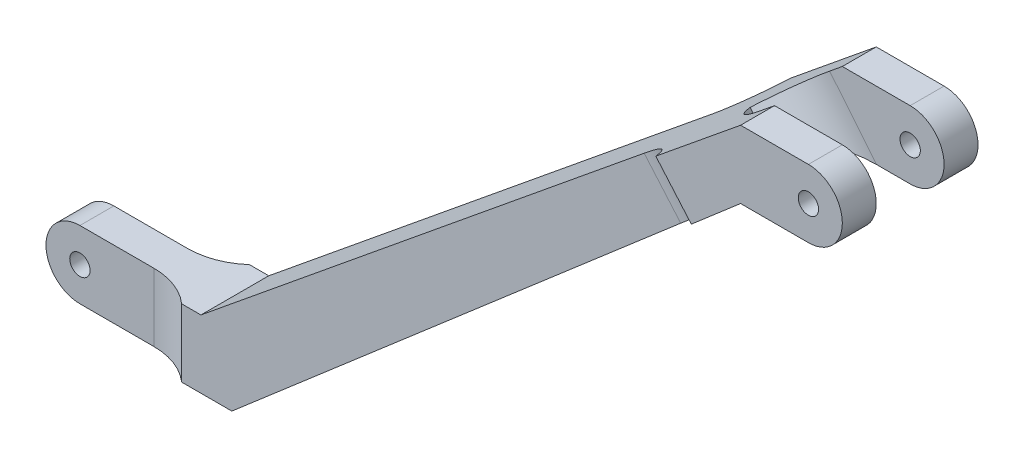
ISO-10303-21;
HEADER;
FILE_DESCRIPTION(('STEP AP214'),'2;1');
FILE_NAME('part.step','',(''),(''),'','','');
FILE_SCHEMA(('AUTOMOTIVE_DESIGN { 1 0 10303 214 1 1 1 1 }'));
ENDSEC;
DATA;
#1=APPLICATION_CONTEXT('core data for automotive mechanical design processes');
#2=APPLICATION_PROTOCOL_DEFINITION('international standard','automotive_design',2000,#1);
#3=PRODUCT_CONTEXT('',#1,'mechanical');
#4=PRODUCT('Part','Part','',(#3));
#5=PRODUCT_RELATED_PRODUCT_CATEGORY('part','',(#4));
#6=PRODUCT_DEFINITION_FORMATION('','',#4);
#7=PRODUCT_DEFINITION_CONTEXT('part definition',#1,'design');
#8=PRODUCT_DEFINITION('design','',#6,#7);
#9=PRODUCT_DEFINITION_SHAPE('','',#8);
#10=(LENGTH_UNIT() NAMED_UNIT(*) SI_UNIT(.MILLI.,.METRE.));
#11=(NAMED_UNIT(*) PLANE_ANGLE_UNIT() SI_UNIT($,.RADIAN.));
#12=(NAMED_UNIT(*) SI_UNIT($,.STERADIAN.) SOLID_ANGLE_UNIT());
#13=UNCERTAINTY_MEASURE_WITH_UNIT(LENGTH_MEASURE(1.E-05),#10,'distance_accuracy_value','');
#14=(GEOMETRIC_REPRESENTATION_CONTEXT(3) GLOBAL_UNCERTAINTY_ASSIGNED_CONTEXT((#13)) GLOBAL_UNIT_ASSIGNED_CONTEXT((#10,
#11,#12)) REPRESENTATION_CONTEXT('',''));
#15=CARTESIAN_POINT('',(0.,0.,0.));
#16=DIRECTION('',(0.,0.,1.));
#17=DIRECTION('',(1.,0.,0.));
#18=AXIS2_PLACEMENT_3D('',#15,#16,#17);
#19=CARTESIAN_POINT('',(0.,-5.,10.));
#20=DIRECTION('',(0.,1.,0.));
#21=DIRECTION('',(-1.,0.,0.));
#22=AXIS2_PLACEMENT_3D('',#19,#20,#21);
#23=PLANE('',#22);
#24=DIRECTION('',(0.,0.,-1.));
#25=VECTOR('',#24,1.);
#26=CARTESIAN_POINT('',(-10.,-5.,10.));
#27=LINE('',#26,#25);
#28=CARTESIAN_POINT('',(-10.,-5.,15.));
#29=VERTEX_POINT('',#28);
#30=CARTESIAN_POINT('',(-10.,-5.,9.20435754022233));
#31=VERTEX_POINT('',#30);
#32=EDGE_CURVE('E49',#29,#31,#27,.T.);
#33=ORIENTED_EDGE('',*,*,#32,.T.);
#34=CARTESIAN_POINT('',(-4.95474912406924,-5.,0.));
#35=DIRECTION('',(0.,1.,0.));
#36=DIRECTION('',(1.,0.,0.));
#37=AXIS2_PLACEMENT_3D('',#34,#35,#36);
#38=ELLIPSE('',#37,12.9069580740723,10.);
#39=CARTESIAN_POINT('',(-4.95474912406924,-5.,10.));
#40=VERTEX_POINT('',#39);
#41=EDGE_CURVE('E286',#31,#40,#38,.T.);
#42=ORIENTED_EDGE('',*,*,#41,.T.);
#43=DIRECTION('',(1.,0.,0.));
#44=VECTOR('',#43,1.);
#45=CARTESIAN_POINT('',(0.,-5.,10.));
#46=LINE('',#45,#44);
#47=CARTESIAN_POINT('',(0.,-5.,10.));
#48=VERTEX_POINT('',#47);
#49=EDGE_CURVE('E344',#40,#48,#46,.T.);
#50=ORIENTED_EDGE('',*,*,#49,.T.);
#51=DIRECTION('',(0.,0.,-1.));
#52=VECTOR('',#51,1.);
#53=CARTESIAN_POINT('',(0.,-5.,10.));
#54=LINE('',#53,#52);
#55=CARTESIAN_POINT('',(0.,-5.,15.));
#56=VERTEX_POINT('',#55);
#57=EDGE_CURVE('E231',#56,#48,#54,.T.);
#58=ORIENTED_EDGE('',*,*,#57,.F.);
#59=DIRECTION('',(1.,0.,0.));
#60=VECTOR('',#59,1.);
#61=CARTESIAN_POINT('',(0.,-5.,15.));
#62=LINE('',#61,#60);
#63=EDGE_CURVE('E359',#29,#56,#62,.T.);
#64=ORIENTED_EDGE('',*,*,#63,.F.);
#65=EDGE_LOOP('',(#33,#42,#50,#58,#64));
#66=FACE_BOUND('',#65,.T.);
#67=ADVANCED_FACE('F33',(#66),#23,.F.);
#68=CARTESIAN_POINT('',(0.,5.,10.));
#69=DIRECTION('',(0.,-1.,0.));
#70=DIRECTION('',(1.,0.,0.));
#71=AXIS2_PLACEMENT_3D('',#68,#69,#70);
#72=PLANE('',#71);
#73=DIRECTION('',(1.,0.,0.));
#74=VECTOR('',#73,1.);
#75=CARTESIAN_POINT('',(-7.50000000000001,5.,10.));
#76=LINE('',#75,#74);
#77=CARTESIAN_POINT('',(-10.,5.,10.));
#78=VERTEX_POINT('',#77);
#79=CARTESIAN_POINT('',(0.,5.,10.));
#80=VERTEX_POINT('',#79);
#81=EDGE_CURVE('E199',#78,#80,#76,.T.);
#82=ORIENTED_EDGE('',*,*,#81,.F.);
#83=DIRECTION('',(0.,0.,-1.));
#84=VECTOR('',#83,1.);
#85=CARTESIAN_POINT('',(-10.,5.,10.));
#86=LINE('',#85,#84);
#87=CARTESIAN_POINT('',(-10.,5.,15.));
#88=VERTEX_POINT('',#87);
#89=EDGE_CURVE('E216',#88,#78,#86,.T.);
#90=ORIENTED_EDGE('',*,*,#89,.F.);
#91=DIRECTION('',(-1.,0.,0.));
#92=VECTOR('',#91,1.);
#93=CARTESIAN_POINT('',(0.,5.,15.));
#94=LINE('',#93,#92);
#95=CARTESIAN_POINT('',(0.,5.,15.));
#96=VERTEX_POINT('',#95);
#97=EDGE_CURVE('E356',#96,#88,#94,.T.);
#98=ORIENTED_EDGE('',*,*,#97,.F.);
#99=DIRECTION('',(0.,0.,-1.));
#100=VECTOR('',#99,1.);
#101=CARTESIAN_POINT('',(0.,5.,10.));
#102=LINE('',#101,#100);
#103=EDGE_CURVE('E227',#96,#80,#102,.T.);
#104=ORIENTED_EDGE('',*,*,#103,.T.);
#105=EDGE_LOOP('',(#82,#90,#98,#104));
#106=FACE_BOUND('',#105,.T.);
#107=ADVANCED_FACE('F415',(#106),#72,.F.);
#108=CARTESIAN_POINT('',(0.,0.,10.));
#109=DIRECTION('',(0.,0.,1.));
#110=DIRECTION('',(1.,0.,0.));
#111=AXIS2_PLACEMENT_3D('',#108,#109,#110);
#112=PLANE('',#111);
#113=DIRECTION('',(0.757248519517734,0.653126848084046,0.));
#114=VECTOR('',#113,1.);
#115=CARTESIAN_POINT('',(-90.,-74.,10.));
#116=LINE('',#115,#114);
#117=CARTESIAN_POINT('',(-90.,-74.,10.));
#118=VERTEX_POINT('',#117);
#119=CARTESIAN_POINT('',(-23.8248471832808,-16.9239306955797,10.));
#120=VERTEX_POINT('',#119);
#121=EDGE_CURVE('E217',#118,#120,#116,.T.);
#122=ORIENTED_EDGE('',*,*,#121,.T.);
#123=DIRECTION('',(-0.653126848084046,0.757248519517734,0.));
#124=VECTOR('',#123,1.);
#125=CARTESIAN_POINT('',(-29.0579645488051,-10.8565482427978,10.));
#126=LINE('',#125,#124);
#127=CARTESIAN_POINT('',(-29.2122518202634,-10.6776644498027,10.));
#128=VERTEX_POINT('',#127);
#129=EDGE_CURVE('E272',#120,#128,#126,.T.);
#130=ORIENTED_EDGE('',*,*,#129,.T.);
#131=DIRECTION('',(-0.774775895498427,-0.632235962085843,0.));
#132=VECTOR('',#131,1.);
#133=CARTESIAN_POINT('',(-94.5563049166332,-64.,10.));
#134=LINE('',#133,#132);
#135=CARTESIAN_POINT('',(-94.5563049166332,-64.,10.));
#136=VERTEX_POINT('',#135);
#137=EDGE_CURVE('E382',#128,#136,#134,.T.);
#138=ORIENTED_EDGE('',*,*,#137,.T.);
#139=DIRECTION('',(-1.,0.,0.));
#140=VECTOR('',#139,1.);
#141=CARTESIAN_POINT('',(-114.8954508,-64.,10.));
#142=LINE('',#141,#140);
#143=CARTESIAN_POINT('',(-97.3954508,-64.,10.));
#144=VERTEX_POINT('',#143);
#145=EDGE_CURVE('E384',#136,#144,#142,.T.);
#146=ORIENTED_EDGE('',*,*,#145,.T.);
#147=DIRECTION('',(0.,1.,0.));
#148=VECTOR('',#147,1.);
#149=CARTESIAN_POINT('',(-97.3954507999999,1.3290955356726E-13,10.));
#150=LINE('',#149,#148);
#151=CARTESIAN_POINT('',(-97.3954508,-74.,10.));
#152=VERTEX_POINT('',#151);
#153=EDGE_CURVE('E371',#152,#144,#150,.T.);
#154=ORIENTED_EDGE('',*,*,#153,.F.);
#155=DIRECTION('',(1.,0.,0.));
#156=VECTOR('',#155,1.);
#157=CARTESIAN_POINT('',(-90.,-74.,10.));
#158=LINE('',#157,#156);
#159=EDGE_CURVE('E221',#152,#118,#158,.T.);
#160=ORIENTED_EDGE('',*,*,#159,.T.);
#161=EDGE_LOOP('',(#122,#130,#138,#146,#154,#160));
#162=FACE_BOUND('',#161,.T.);
#163=ADVANCED_FACE('F401',(#162),#112,.T.);
#164=CARTESIAN_POINT('',(0.,0.,0.));
#165=DIRECTION('',(0.,0.,1.));
#166=DIRECTION('',(1.,0.,0.));
#167=AXIS2_PLACEMENT_3D('',#164,#165,#166);
#168=PLANE('',#167);
#169=DIRECTION('',(-0.774775895498427,-0.632235962085843,0.));
#170=VECTOR('',#169,1.);
#171=CARTESIAN_POINT('',(-94.5563049166332,-64.,0.));
#172=LINE('',#171,#170);
#173=CARTESIAN_POINT('',(-29.2122518202634,-10.6776644498027,0.));
#174=VERTEX_POINT('',#173);
#175=CARTESIAN_POINT('',(-94.5563049166332,-64.,0.));
#176=VERTEX_POINT('',#175);
#177=EDGE_CURVE('E302',#174,#176,#172,.T.);
#178=ORIENTED_EDGE('',*,*,#177,.F.);
#179=DIRECTION('',(0.653126848084046,-0.757248519517734,0.));
#180=VECTOR('',#179,1.);
#181=CARTESIAN_POINT('',(-22.0319970802434,-19.00259748171,0.));
#182=LINE('',#181,#180);
#183=CARTESIAN_POINT('',(-23.8248471832808,-16.9239306955797,0.));
#184=VERTEX_POINT('',#183);
#185=EDGE_CURVE('E275',#174,#184,#182,.T.);
#186=ORIENTED_EDGE('',*,*,#185,.T.);
#187=DIRECTION('',(0.757248519517734,0.653126848084046,0.));
#188=VECTOR('',#187,1.);
#189=CARTESIAN_POINT('',(-90.,-74.,0.));
#190=LINE('',#189,#188);
#191=CARTESIAN_POINT('',(-90.,-74.,0.));
#192=VERTEX_POINT('',#191);
#193=EDGE_CURVE('E225',#192,#184,#190,.T.);
#194=ORIENTED_EDGE('',*,*,#193,.F.);
#195=DIRECTION('',(1.,0.,0.));
#196=VECTOR('',#195,1.);
#197=CARTESIAN_POINT('',(-90.,-74.,0.));
#198=LINE('',#197,#196);
#199=CARTESIAN_POINT('',(-97.3954508,-74.,0.));
#200=VERTEX_POINT('',#199);
#201=EDGE_CURVE('E388',#200,#192,#198,.T.);
#202=ORIENTED_EDGE('',*,*,#201,.F.);
#203=DIRECTION('',(0.,1.,0.));
#204=VECTOR('',#203,1.);
#205=CARTESIAN_POINT('',(-97.3954507999999,1.3290955356726E-13,0.));
#206=LINE('',#205,#204);
#207=CARTESIAN_POINT('',(-97.3954508,-64.,0.));
#208=VERTEX_POINT('',#207);
#209=EDGE_CURVE('E316',#200,#208,#206,.T.);
#210=ORIENTED_EDGE('',*,*,#209,.T.);
#211=DIRECTION('',(-1.,0.,0.));
#212=VECTOR('',#211,1.);
#213=CARTESIAN_POINT('',(-114.8954508,-64.,0.));
#214=LINE('',#213,#212);
#215=EDGE_CURVE('E315',#176,#208,#214,.T.);
#216=ORIENTED_EDGE('',*,*,#215,.F.);
#217=EDGE_LOOP('',(#178,#186,#194,#202,#210,#216));
#218=FACE_BOUND('',#217,.T.);
#219=ADVANCED_FACE('F310',(#218),#168,.F.);
#220=CARTESIAN_POINT('',(0.,0.,10.));
#221=DIRECTION('',(0.,0.,-1.));
#222=DIRECTION('',(-1.,0.,0.));
#223=AXIS2_PLACEMENT_3D('',#220,#221,#222);
#224=CYLINDRICAL_SURFACE('',#223,5.);
#225=ORIENTED_EDGE('',*,*,#57,.T.);
#226=CARTESIAN_POINT('',(0.,0.,10.));
#227=DIRECTION('',(0.,0.,1.));
#228=DIRECTION('',(1.,0.,0.));
#229=AXIS2_PLACEMENT_3D('',#226,#227,#228);
#230=CIRCLE('',#229,5.);
#231=EDGE_CURVE('E262',#48,#80,#230,.T.);
#232=ORIENTED_EDGE('',*,*,#231,.T.);
#233=ORIENTED_EDGE('',*,*,#103,.F.);
#234=CARTESIAN_POINT('',(0.,0.,15.));
#235=DIRECTION('',(0.,0.,1.));
#236=DIRECTION('',(1.,0.,0.));
#237=AXIS2_PLACEMENT_3D('',#234,#235,#236);
#238=CIRCLE('',#237,5.);
#239=EDGE_CURVE('E353',#56,#96,#238,.T.);
#240=ORIENTED_EDGE('',*,*,#239,.F.);
#241=EDGE_LOOP('',(#225,#232,#233,#240));
#242=FACE_BOUND('',#241,.T.);
#243=ADVANCED_FACE('F440',(#242),#224,.T.);
#244=CARTESIAN_POINT('',(0.,0.,10.));
#245=DIRECTION('',(0.,0.,-1.));
#246=DIRECTION('',(-1.,0.,0.));
#247=AXIS2_PLACEMENT_3D('',#244,#245,#246);
#248=CYLINDRICAL_SURFACE('',#247,1.5);
#249=CARTESIAN_POINT('',(0.,0.,10.));
#250=DIRECTION('',(0.,0.,1.));
#251=DIRECTION('',(1.,0.,0.));
#252=AXIS2_PLACEMENT_3D('',#249,#250,#251);
#253=CIRCLE('',#252,1.5);
#254=CARTESIAN_POINT('',(1.5,0.,10.));
#255=VERTEX_POINT('',#254);
#256=EDGE_CURVE('E259',#255,#255,#253,.T.);
#257=ORIENTED_EDGE('',*,*,#256,.F.);
#258=EDGE_LOOP('',(#257));
#259=FACE_BOUND('',#258,.T.);
#260=CARTESIAN_POINT('',(0.,0.,15.));
#261=DIRECTION('',(0.,0.,1.));
#262=DIRECTION('',(1.,0.,0.));
#263=AXIS2_PLACEMENT_3D('',#260,#261,#262);
#264=CIRCLE('',#263,1.5);
#265=CARTESIAN_POINT('',(1.5,0.,15.));
#266=VERTEX_POINT('',#265);
#267=EDGE_CURVE('E347',#266,#266,#264,.T.);
#268=ORIENTED_EDGE('',*,*,#267,.T.);
#269=EDGE_LOOP('',(#268));
#270=FACE_BOUND('',#269,.T.);
#271=ADVANCED_FACE('F485',(#259,#270),#248,.F.);
#272=CARTESIAN_POINT('',(-94.5563049166332,-64.,10.));
#273=DIRECTION('',(0.632235962085843,-0.774775895498427,0.));
#274=DIRECTION('',(0.774775895498427,0.632235962085843,0.));
#275=AXIS2_PLACEMENT_3D('',#272,#273,#274);
#276=PLANE('',#275);
#277=ORIENTED_EDGE('',*,*,#89,.T.);
#278=DIRECTION('',(0.774775895498427,0.632235962085843,0.));
#279=VECTOR('',#278,1.);
#280=CARTESIAN_POINT('',(-2.57254955851082,11.0609800885698,10.));
#281=LINE('',#280,#279);
#282=CARTESIAN_POINT('',(-11.8698603044919,3.47414854353973,10.));
#283=VERTEX_POINT('',#282);
#284=EDGE_CURVE('E210',#283,#78,#281,.T.);
#285=ORIENTED_EDGE('',*,*,#284,.F.);
#286=CARTESIAN_POINT('',(-11.8698603044919,3.47414854353973,0.));
#287=DIRECTION('',(0.632235962085843,-0.774775895498427,0.));
#288=DIRECTION('',(0.774775895498427,0.632235962085843,0.));
#289=AXIS2_PLACEMENT_3D('',#286,#287,#288);
#290=CIRCLE('',#289,10.);
#291=CARTESIAN_POINT('',(-18.5796163819067,-2.00117549998462,5.));
#292=VERTEX_POINT('',#291);
#293=EDGE_CURVE('E282',#283,#292,#290,.T.);
#294=ORIENTED_EDGE('',*,*,#293,.T.);
#295=CARTESIAN_POINT('',(-11.8698603044919,3.47414854353973,10.));
#296=DIRECTION('',(0.632235962085843,-0.774775895498427,0.));
#297=DIRECTION('',(0.774775895498427,0.632235962085843,0.));
#298=AXIS2_PLACEMENT_3D('',#295,#296,#297);
#299=CIRCLE('',#298,10.);
#300=CARTESIAN_POINT('',(-11.8698603044919,3.47414854353973,0.));
#301=VERTEX_POINT('',#300);
#302=EDGE_CURVE('E209',#292,#301,#299,.T.);
#303=ORIENTED_EDGE('',*,*,#302,.T.);
#304=DIRECTION('',(-0.774775895498427,-0.632235962085843,0.));
#305=VECTOR('',#304,1.);
#306=CARTESIAN_POINT('',(-2.57254955851082,11.0609800885698,0.));
#307=LINE('',#306,#305);
#308=CARTESIAN_POINT('',(-10.,5.,0.));
#309=VERTEX_POINT('',#308);
#310=EDGE_CURVE('E192',#309,#301,#307,.T.);
#311=ORIENTED_EDGE('',*,*,#310,.F.);
#312=CARTESIAN_POINT('',(-10.,5.,-5.));
#313=VERTEX_POINT('',#312);
#314=EDGE_CURVE('E206',#309,#313,#86,.T.);
#315=ORIENTED_EDGE('',*,*,#314,.T.);
#316=DIRECTION('',(-0.774775895498427,-0.632235962085843,0.));
#317=VECTOR('',#316,1.);
#318=CARTESIAN_POINT('',(-10.,5.,-5.));
#319=LINE('',#318,#317);
#320=CARTESIAN_POINT('',(-22.5,-5.2003038194534,-5.));
#321=VERTEX_POINT('',#320);
#322=EDGE_CURVE('E304',#313,#321,#319,.T.);
#323=ORIENTED_EDGE('',*,*,#322,.T.);
#324=CARTESIAN_POINT('',(-29.2122518202634,-10.6776644498027,-10.));
#325=DIRECTION('',(0.632235962085843,-0.774775895498427,0.));
#326=DIRECTION('',(0.774775895498427,0.632235962085843,0.));
#327=AXIS2_PLACEMENT_3D('',#324,#325,#326);
#328=ELLIPSE('',#327,10.0037195731408,10.);
#329=EDGE_CURVE('E42',#321,#174,#328,.T.);
#330=ORIENTED_EDGE('',*,*,#329,.T.);
#331=ORIENTED_EDGE('',*,*,#177,.T.);
#332=DIRECTION('',(0.,0.,-1.));
#333=VECTOR('',#332,1.);
#334=CARTESIAN_POINT('',(-94.5563049166332,-64.,10.));
#335=LINE('',#334,#333);
#336=EDGE_CURVE('E242',#136,#176,#335,.T.);
#337=ORIENTED_EDGE('',*,*,#336,.F.);
#338=ORIENTED_EDGE('',*,*,#137,.F.);
#339=CARTESIAN_POINT('',(-29.2122518202634,-10.6776644498027,20.));
#340=DIRECTION('',(0.632235962085843,-0.774775895498427,0.));
#341=DIRECTION('',(0.774775895498427,0.632235962085843,0.));
#342=AXIS2_PLACEMENT_3D('',#339,#340,#341);
#343=ELLIPSE('',#342,10.0037195731408,10.);
#344=CARTESIAN_POINT('',(-22.5,-5.2003038194534,15.));
#345=VERTEX_POINT('',#344);
#346=EDGE_CURVE('E296',#128,#345,#343,.T.);
#347=ORIENTED_EDGE('',*,*,#346,.T.);
#348=DIRECTION('',(-0.774775895498427,-0.632235962085843,0.));
#349=VECTOR('',#348,1.);
#350=CARTESIAN_POINT('',(-10.,5.,15.));
#351=LINE('',#350,#349);
#352=EDGE_CURVE('E330',#88,#345,#351,.T.);
#353=ORIENTED_EDGE('',*,*,#352,.F.);
#354=EDGE_LOOP('',(#277,#285,#294,#303,#311,#315,#323,#330,#331,#337,#338,#347,#353));
#355=FACE_BOUND('',#354,.T.);
#356=ADVANCED_FACE('F204',(#355),#276,.F.);
#357=CARTESIAN_POINT('',(-114.8954508,-64.,10.));
#358=DIRECTION('',(0.,-1.,0.));
#359=DIRECTION('',(1.,0.,0.));
#360=AXIS2_PLACEMENT_3D('',#357,#358,#359);
#361=PLANE('',#360);
#362=DIRECTION('',(0.,0.,-1.));
#363=VECTOR('',#362,1.);
#364=CARTESIAN_POINT('',(-114.8954508,-64.,10.));
#365=LINE('',#364,#363);
#366=CARTESIAN_POINT('',(-114.8954508,-64.,7.5));
#367=VERTEX_POINT('',#366);
#368=CARTESIAN_POINT('',(-114.8954508,-64.,2.5));
#369=VERTEX_POINT('',#368);
#370=EDGE_CURVE('E240',#367,#369,#365,.T.);
#371=ORIENTED_EDGE('',*,*,#370,.F.);
#372=DIRECTION('',(-1.,0.,0.));
#373=VECTOR('',#372,1.);
#374=CARTESIAN_POINT('',(-142.3954508,-63.9999999999999,7.5));
#375=LINE('',#374,#373);
#376=CARTESIAN_POINT('',(-104.009829077661,-64.,7.5));
#377=VERTEX_POINT('',#376);
#378=EDGE_CURVE('E255',#377,#367,#375,.T.);
#379=ORIENTED_EDGE('',*,*,#378,.F.);
#380=CARTESIAN_POINT('',(-104.009829077661,-64.,17.5));
#381=DIRECTION('',(0.,-1.,0.));
#382=DIRECTION('',(1.,0.,0.));
#383=AXIS2_PLACEMENT_3D('',#380,#381,#382);
#384=CIRCLE('',#383,10.);
#385=EDGE_CURVE('E292',#377,#144,#384,.T.);
#386=ORIENTED_EDGE('',*,*,#385,.T.);
#387=ORIENTED_EDGE('',*,*,#145,.F.);
#388=ORIENTED_EDGE('',*,*,#336,.T.);
#389=ORIENTED_EDGE('',*,*,#215,.T.);
#390=CARTESIAN_POINT('',(-104.009829077662,-64.,-7.5));
#391=DIRECTION('',(0.,-1.,0.));
#392=DIRECTION('',(1.,0.,0.));
#393=AXIS2_PLACEMENT_3D('',#390,#391,#392);
#394=CIRCLE('',#393,10.);
#395=CARTESIAN_POINT('',(-104.009829077662,-64.,2.5));
#396=VERTEX_POINT('',#395);
#397=EDGE_CURVE('E288',#208,#396,#394,.T.);
#398=ORIENTED_EDGE('',*,*,#397,.T.);
#399=DIRECTION('',(1.,0.,0.));
#400=VECTOR('',#399,1.);
#401=CARTESIAN_POINT('',(-142.3954508,-63.9999999999999,2.5));
#402=LINE('',#401,#400);
#403=EDGE_CURVE('E250',#369,#396,#402,.T.);
#404=ORIENTED_EDGE('',*,*,#403,.F.);
#405=EDGE_LOOP('',(#371,#379,#386,#387,#388,#389,#398,#404));
#406=FACE_BOUND('',#405,.T.);
#407=ADVANCED_FACE('F479',(#406),#361,.F.);
#408=CARTESIAN_POINT('',(-114.8954508,-69.,10.));
#409=DIRECTION('',(0.,0.,-1.));
#410=DIRECTION('',(-1.,0.,0.));
#411=AXIS2_PLACEMENT_3D('',#408,#409,#410);
#412=CYLINDRICAL_SURFACE('',#411,5.00000000000003);
#413=DIRECTION('',(0.,0.,-1.));
#414=VECTOR('',#413,1.);
#415=CARTESIAN_POINT('',(-114.8954508,-74.,10.));
#416=LINE('',#415,#414);
#417=CARTESIAN_POINT('',(-114.8954508,-74.,7.5));
#418=VERTEX_POINT('',#417);
#419=CARTESIAN_POINT('',(-114.8954508,-74.,2.5));
#420=VERTEX_POINT('',#419);
#421=EDGE_CURVE('E238',#418,#420,#416,.T.);
#422=ORIENTED_EDGE('',*,*,#421,.F.);
#423=CARTESIAN_POINT('',(-114.8954508,-69.,7.5));
#424=DIRECTION('',(0.,0.,-1.));
#425=DIRECTION('',(-1.,0.,0.));
#426=AXIS2_PLACEMENT_3D('',#423,#424,#425);
#427=CIRCLE('',#426,5.00000000000003);
#428=EDGE_CURVE('E368',#418,#367,#427,.T.);
#429=ORIENTED_EDGE('',*,*,#428,.T.);
#430=ORIENTED_EDGE('',*,*,#370,.T.);
#431=CARTESIAN_POINT('',(-114.8954508,-69.,2.5));
#432=DIRECTION('',(0.,0.,1.));
#433=DIRECTION('',(1.,0.,0.));
#434=AXIS2_PLACEMENT_3D('',#431,#432,#433);
#435=CIRCLE('',#434,5.00000000000003);
#436=EDGE_CURVE('E378',#369,#420,#435,.T.);
#437=ORIENTED_EDGE('',*,*,#436,.T.);
#438=EDGE_LOOP('',(#422,#429,#430,#437));
#439=FACE_BOUND('',#438,.T.);
#440=ADVANCED_FACE('F474',(#439),#412,.T.);
#441=CARTESIAN_POINT('',(-90.,-74.,10.));
#442=DIRECTION('',(0.,1.,0.));
#443=DIRECTION('',(-1.,0.,0.));
#444=AXIS2_PLACEMENT_3D('',#441,#442,#443);
#445=PLANE('',#444);
#446=ORIENTED_EDGE('',*,*,#159,.F.);
#447=CARTESIAN_POINT('',(-104.009829077662,-74.,17.5));
#448=DIRECTION('',(0.,1.,0.));
#449=DIRECTION('',(-1.,0.,0.));
#450=AXIS2_PLACEMENT_3D('',#447,#448,#449);
#451=CIRCLE('',#450,10.);
#452=CARTESIAN_POINT('',(-104.009829077662,-74.,7.5));
#453=VERTEX_POINT('',#452);
#454=EDGE_CURVE('E294',#152,#453,#451,.T.);
#455=ORIENTED_EDGE('',*,*,#454,.T.);
#456=DIRECTION('',(-1.,0.,0.));
#457=VECTOR('',#456,1.);
#458=CARTESIAN_POINT('',(-90.,-74.,7.5));
#459=LINE('',#458,#457);
#460=EDGE_CURVE('E254',#453,#418,#459,.T.);
#461=ORIENTED_EDGE('',*,*,#460,.T.);
#462=ORIENTED_EDGE('',*,*,#421,.T.);
#463=DIRECTION('',(1.,0.,0.));
#464=VECTOR('',#463,1.);
#465=CARTESIAN_POINT('',(-90.,-74.,2.5));
#466=LINE('',#465,#464);
#467=CARTESIAN_POINT('',(-104.009829077662,-74.,2.5));
#468=VERTEX_POINT('',#467);
#469=EDGE_CURVE('E249',#420,#468,#466,.T.);
#470=ORIENTED_EDGE('',*,*,#469,.T.);
#471=CARTESIAN_POINT('',(-104.009829077662,-74.,-7.5));
#472=DIRECTION('',(0.,1.,0.));
#473=DIRECTION('',(-1.,0.,0.));
#474=AXIS2_PLACEMENT_3D('',#471,#472,#473);
#475=CIRCLE('',#474,10.);
#476=EDGE_CURVE('E290',#468,#200,#475,.T.);
#477=ORIENTED_EDGE('',*,*,#476,.T.);
#478=ORIENTED_EDGE('',*,*,#201,.T.);
#479=DIRECTION('',(0.,0.,-1.));
#480=VECTOR('',#479,1.);
#481=CARTESIAN_POINT('',(-90.,-74.,10.));
#482=LINE('',#481,#480);
#483=EDGE_CURVE('E235',#118,#192,#482,.T.);
#484=ORIENTED_EDGE('',*,*,#483,.F.);
#485=EDGE_LOOP('',(#446,#455,#461,#462,#470,#477,#478,#484));
#486=FACE_BOUND('',#485,.T.);
#487=ADVANCED_FACE('F393',(#486),#445,.F.);
#488=CARTESIAN_POINT('',(-90.,-74.,10.));
#489=DIRECTION('',(-0.653126848084046,0.757248519517734,0.));
#490=DIRECTION('',(-0.757248519517734,-0.653126848084046,0.));
#491=AXIS2_PLACEMENT_3D('',#488,#489,#490);
#492=PLANE('',#491);
#493=CARTESIAN_POINT('',(-7.03886089918652,-2.44601752554837,10.));
#494=DIRECTION('',(-0.653126848084046,0.757248519517734,0.));
#495=DIRECTION('',(-0.757248519517734,-0.653126848084046,0.));
#496=AXIS2_PLACEMENT_3D('',#493,#494,#495);
#497=ELLIPSE('',#496,10.0037195731408,10.);
#498=CARTESIAN_POINT('',(-10.,-5.,0.795642459777663));
#499=VERTEX_POINT('',#498);
#500=CARTESIAN_POINT('',(-13.5992647308711,-8.1043658303763,5.));
#501=VERTEX_POINT('',#500);
#502=EDGE_CURVE('E280',#499,#501,#497,.T.);
#503=ORIENTED_EDGE('',*,*,#502,.T.);
#504=CARTESIAN_POINT('',(-7.03886089918652,-2.44601752554837,0.));
#505=DIRECTION('',(-0.653126848084046,0.757248519517734,0.));
#506=DIRECTION('',(-0.757248519517734,-0.653126848084046,0.));
#507=AXIS2_PLACEMENT_3D('',#504,#505,#506);
#508=ELLIPSE('',#507,10.0037195731408,10.);
#509=EDGE_CURVE('E284',#501,#31,#508,.T.);
#510=ORIENTED_EDGE('',*,*,#509,.T.);
#511=ORIENTED_EDGE('',*,*,#32,.F.);
#512=DIRECTION('',(0.757248519517733,0.653126848084047,0.));
#513=VECTOR('',#512,1.);
#514=CARTESIAN_POINT('',(-17.2668826344756,-11.2676862722353,15.));
#515=LINE('',#514,#513);
#516=CARTESIAN_POINT('',(-17.2668826344756,-11.2676862722353,15.));
#517=VERTEX_POINT('',#516);
#518=EDGE_CURVE('E200',#517,#29,#515,.T.);
#519=ORIENTED_EDGE('',*,*,#518,.F.);
#520=CARTESIAN_POINT('',(-23.8248471832808,-16.9239306955797,20.));
#521=DIRECTION('',(-0.653126848084046,0.757248519517734,0.));
#522=DIRECTION('',(-0.757248519517734,-0.653126848084046,0.));
#523=AXIS2_PLACEMENT_3D('',#520,#521,#522);
#524=CIRCLE('',#523,10.);
#525=EDGE_CURVE('E298',#517,#120,#524,.T.);
#526=ORIENTED_EDGE('',*,*,#525,.T.);
#527=ORIENTED_EDGE('',*,*,#121,.F.);
#528=ORIENTED_EDGE('',*,*,#483,.T.);
#529=ORIENTED_EDGE('',*,*,#193,.T.);
#530=CARTESIAN_POINT('',(-23.8248471832808,-16.9239306955797,-10.));
#531=DIRECTION('',(-0.653126848084046,0.757248519517734,0.));
#532=DIRECTION('',(-0.757248519517734,-0.653126848084046,0.));
#533=AXIS2_PLACEMENT_3D('',#530,#531,#532);
#534=CIRCLE('',#533,10.);
#535=CARTESIAN_POINT('',(-17.2668826344756,-11.2676862722353,-5.));
#536=VERTEX_POINT('',#535);
#537=EDGE_CURVE('E11',#184,#536,#534,.T.);
#538=ORIENTED_EDGE('',*,*,#537,.T.);
#539=DIRECTION('',(0.757248519517733,0.653126848084047,0.));
#540=VECTOR('',#539,1.);
#541=CARTESIAN_POINT('',(-17.2668826344756,-11.2676862722353,-5.));
#542=LINE('',#541,#540);
#543=CARTESIAN_POINT('',(-10.,-5.,-5.));
#544=VERTEX_POINT('',#543);
#545=EDGE_CURVE('E322',#536,#544,#542,.T.);
#546=ORIENTED_EDGE('',*,*,#545,.T.);
#547=EDGE_CURVE('E57',#499,#544,#27,.T.);
#548=ORIENTED_EDGE('',*,*,#547,.F.);
#549=EDGE_LOOP('',(#503,#510,#511,#519,#526,#527,#528,#529,#538,#546,#548));
#550=FACE_BOUND('',#549,.T.);
#551=ADVANCED_FACE('F321',(#550),#492,.F.);
#552=DIRECTION('',(-1.,0.,0.));
#553=VECTOR('',#552,1.);
#554=CARTESIAN_POINT('',(0.,-5.,0.));
#555=LINE('',#554,#553);
#556=CARTESIAN_POINT('',(0.,-5.,0.));
#557=VERTEX_POINT('',#556);
#558=CARTESIAN_POINT('',(-4.95474912406924,-5.,0.));
#559=VERTEX_POINT('',#558);
#560=EDGE_CURVE('E263',#557,#559,#555,.T.);
#561=ORIENTED_EDGE('',*,*,#560,.T.);
#562=CARTESIAN_POINT('',(-4.95474912406924,-5.,10.));
#563=DIRECTION('',(0.,1.,0.));
#564=DIRECTION('',(1.,0.,0.));
#565=AXIS2_PLACEMENT_3D('',#562,#563,#564);
#566=ELLIPSE('',#565,12.9069580740723,10.);
#567=EDGE_CURVE('E278',#559,#499,#566,.T.);
#568=ORIENTED_EDGE('',*,*,#567,.T.);
#569=ORIENTED_EDGE('',*,*,#547,.T.);
#570=DIRECTION('',(1.,0.,0.));
#571=VECTOR('',#570,1.);
#572=CARTESIAN_POINT('',(0.,-5.,-5.));
#573=LINE('',#572,#571);
#574=CARTESIAN_POINT('',(0.,-5.,-5.));
#575=VERTEX_POINT('',#574);
#576=EDGE_CURVE('E329',#544,#575,#573,.T.);
#577=ORIENTED_EDGE('',*,*,#576,.T.);
#578=EDGE_CURVE('E230',#557,#575,#54,.T.);
#579=ORIENTED_EDGE('',*,*,#578,.F.);
#580=EDGE_LOOP('',(#561,#568,#569,#577,#579));
#581=FACE_BOUND('',#580,.T.);
#582=ADVANCED_FACE('F432',(#581),#23,.F.);
#583=CARTESIAN_POINT('',(0.,5.,0.));
#584=VERTEX_POINT('',#583);
#585=CARTESIAN_POINT('',(0.,5.,-5.));
#586=VERTEX_POINT('',#585);
#587=EDGE_CURVE('E219',#584,#586,#102,.T.);
#588=ORIENTED_EDGE('',*,*,#587,.F.);
#589=CARTESIAN_POINT('',(0.,0.,0.));
#590=DIRECTION('',(0.,0.,-1.));
#591=DIRECTION('',(-1.,0.,0.));
#592=AXIS2_PLACEMENT_3D('',#589,#590,#591);
#593=CIRCLE('',#592,5.);
#594=EDGE_CURVE('E195',#584,#557,#593,.T.);
#595=ORIENTED_EDGE('',*,*,#594,.T.);
#596=ORIENTED_EDGE('',*,*,#578,.T.);
#597=CARTESIAN_POINT('',(0.,0.,-5.));
#598=DIRECTION('',(0.,0.,1.));
#599=DIRECTION('',(1.,0.,0.));
#600=AXIS2_PLACEMENT_3D('',#597,#598,#599);
#601=CIRCLE('',#600,5.);
#602=EDGE_CURVE('E350',#575,#586,#601,.T.);
#603=ORIENTED_EDGE('',*,*,#602,.T.);
#604=EDGE_LOOP('',(#588,#595,#596,#603));
#605=FACE_BOUND('',#604,.T.);
#606=ADVANCED_FACE('F434',(#605),#224,.T.);
#607=ORIENTED_EDGE('',*,*,#314,.F.);
#608=DIRECTION('',(-1.,0.,0.));
#609=VECTOR('',#608,1.);
#610=CARTESIAN_POINT('',(-7.50000000000001,5.,0.));
#611=LINE('',#610,#609);
#612=EDGE_CURVE('E188',#584,#309,#611,.T.);
#613=ORIENTED_EDGE('',*,*,#612,.F.);
#614=ORIENTED_EDGE('',*,*,#587,.T.);
#615=DIRECTION('',(-1.,0.,0.));
#616=VECTOR('',#615,1.);
#617=CARTESIAN_POINT('',(0.,5.,-5.));
#618=LINE('',#617,#616);
#619=EDGE_CURVE('E214',#586,#313,#618,.T.);
#620=ORIENTED_EDGE('',*,*,#619,.T.);
#621=EDGE_LOOP('',(#607,#613,#614,#620));
#622=FACE_BOUND('',#621,.T.);
#623=ADVANCED_FACE('F212',(#622),#72,.F.);
#624=CARTESIAN_POINT('',(-114.8954508,-69.,10.));
#625=DIRECTION('',(0.,0.,-1.));
#626=DIRECTION('',(-1.,0.,0.));
#627=AXIS2_PLACEMENT_3D('',#624,#625,#626);
#628=CYLINDRICAL_SURFACE('',#627,1.5);
#629=CARTESIAN_POINT('',(-114.8954508,-69.,7.5));
#630=DIRECTION('',(0.,0.,-1.));
#631=DIRECTION('',(-1.,0.,0.));
#632=AXIS2_PLACEMENT_3D('',#629,#630,#631);
#633=CIRCLE('',#632,1.5);
#634=CARTESIAN_POINT('',(-116.3954508,-69.,7.5));
#635=VERTEX_POINT('',#634);
#636=EDGE_CURVE('E251',#635,#635,#633,.T.);
#637=ORIENTED_EDGE('',*,*,#636,.F.);
#638=EDGE_LOOP('',(#637));
#639=FACE_BOUND('',#638,.T.);
#640=CARTESIAN_POINT('',(-114.8954508,-69.,2.5));
#641=DIRECTION('',(0.,0.,1.));
#642=DIRECTION('',(1.,0.,0.));
#643=AXIS2_PLACEMENT_3D('',#640,#641,#642);
#644=CIRCLE('',#643,1.5);
#645=CARTESIAN_POINT('',(-113.3954508,-69.,2.5));
#646=VERTEX_POINT('',#645);
#647=EDGE_CURVE('E246',#646,#646,#644,.T.);
#648=ORIENTED_EDGE('',*,*,#647,.F.);
#649=EDGE_LOOP('',(#648));
#650=FACE_BOUND('',#649,.T.);
#651=ADVANCED_FACE('F576',(#639,#650),#628,.F.);
#652=CARTESIAN_POINT('',(-142.3954508,-114.,2.5));
#653=DIRECTION('',(0.,0.,1.));
#654=DIRECTION('',(1.,0.,0.));
#655=AXIS2_PLACEMENT_3D('',#652,#653,#654);
#656=PLANE('',#655);
#657=ORIENTED_EDGE('',*,*,#647,.T.);
#658=EDGE_LOOP('',(#657));
#659=FACE_BOUND('',#658,.T.);
#660=ORIENTED_EDGE('',*,*,#403,.T.);
#661=DIRECTION('',(0.,-1.,0.));
#662=VECTOR('',#661,1.);
#663=CARTESIAN_POINT('',(-104.009829077662,-114.,2.5));
#664=LINE('',#663,#662);
#665=EDGE_CURVE('E267',#396,#468,#664,.T.);
#666=ORIENTED_EDGE('',*,*,#665,.T.);
#667=ORIENTED_EDGE('',*,*,#469,.F.);
#668=ORIENTED_EDGE('',*,*,#436,.F.);
#669=EDGE_LOOP('',(#660,#666,#667,#668));
#670=FACE_BOUND('',#669,.T.);
#671=ADVANCED_FACE('F568',(#659,#670),#656,.F.);
#672=CARTESIAN_POINT('',(-142.3954508,-114.,7.5));
#673=DIRECTION('',(0.,0.,-1.));
#674=DIRECTION('',(-1.,0.,0.));
#675=AXIS2_PLACEMENT_3D('',#672,#673,#674);
#676=PLANE('',#675);
#677=ORIENTED_EDGE('',*,*,#636,.T.);
#678=EDGE_LOOP('',(#677));
#679=FACE_BOUND('',#678,.T.);
#680=ORIENTED_EDGE('',*,*,#460,.F.);
#681=DIRECTION('',(0.,-1.,0.));
#682=VECTOR('',#681,1.);
#683=CARTESIAN_POINT('',(-104.009829077662,-114.,7.5));
#684=LINE('',#683,#682);
#685=EDGE_CURVE('E269',#453,#377,#684,.F.);
#686=ORIENTED_EDGE('',*,*,#685,.T.);
#687=ORIENTED_EDGE('',*,*,#378,.T.);
#688=ORIENTED_EDGE('',*,*,#428,.F.);
#689=EDGE_LOOP('',(#680,#686,#687,#688));
#690=FACE_BOUND('',#689,.T.);
#691=ADVANCED_FACE('F559',(#679,#690),#676,.F.);
#692=CARTESIAN_POINT('',(0.,0.,-5.));
#693=DIRECTION('',(0.,0.,1.));
#694=DIRECTION('',(1.,0.,0.));
#695=AXIS2_PLACEMENT_3D('',#692,#693,#694);
#696=PLANE('',#695);
#697=ORIENTED_EDGE('',*,*,#602,.F.);
#698=ORIENTED_EDGE('',*,*,#576,.F.);
#699=ORIENTED_EDGE('',*,*,#545,.F.);
#700=DIRECTION('',(0.653126848084046,-0.757248519517734,0.));
#701=VECTOR('',#700,1.);
#702=CARTESIAN_POINT('',(-22.5,-5.2003038194534,-5.));
#703=LINE('',#702,#701);
#704=EDGE_CURVE('E319',#321,#536,#703,.T.);
#705=ORIENTED_EDGE('',*,*,#704,.F.);
#706=ORIENTED_EDGE('',*,*,#322,.F.);
#707=ORIENTED_EDGE('',*,*,#619,.F.);
#708=EDGE_LOOP('',(#697,#698,#699,#705,#706,#707));
#709=FACE_BOUND('',#708,.T.);
#710=CARTESIAN_POINT('',(0.,0.,-5.));
#711=DIRECTION('',(0.,0.,1.));
#712=DIRECTION('',(1.,0.,0.));
#713=AXIS2_PLACEMENT_3D('',#710,#711,#712);
#714=CIRCLE('',#713,1.5);
#715=CARTESIAN_POINT('',(1.5,0.,-5.));
#716=VERTEX_POINT('',#715);
#717=EDGE_CURVE('E346',#716,#716,#714,.T.);
#718=ORIENTED_EDGE('',*,*,#717,.T.);
#719=EDGE_LOOP('',(#718));
#720=FACE_BOUND('',#719,.T.);
#721=ADVANCED_FACE('F326',(#709,#720),#696,.F.);
#722=CARTESIAN_POINT('',(0.,0.,0.));
#723=DIRECTION('',(0.,0.,-1.));
#724=DIRECTION('',(-1.,0.,0.));
#725=AXIS2_PLACEMENT_3D('',#722,#723,#724);
#726=CIRCLE('',#725,1.5);
#727=CARTESIAN_POINT('',(-1.5,0.,0.));
#728=VERTEX_POINT('',#727);
#729=EDGE_CURVE('E256',#728,#728,#726,.T.);
#730=ORIENTED_EDGE('',*,*,#729,.F.);
#731=EDGE_LOOP('',(#730));
#732=FACE_BOUND('',#731,.T.);
#733=ORIENTED_EDGE('',*,*,#717,.F.);
#734=EDGE_LOOP('',(#733));
#735=FACE_BOUND('',#734,.T.);
#736=ADVANCED_FACE('F451',(#732,#735),#248,.F.);
#737=CARTESIAN_POINT('',(0.,0.,15.));
#738=DIRECTION('',(0.,0.,1.));
#739=DIRECTION('',(1.,0.,0.));
#740=AXIS2_PLACEMENT_3D('',#737,#738,#739);
#741=PLANE('',#740);
#742=ORIENTED_EDGE('',*,*,#239,.T.);
#743=ORIENTED_EDGE('',*,*,#97,.T.);
#744=ORIENTED_EDGE('',*,*,#352,.T.);
#745=DIRECTION('',(0.653126848084046,-0.757248519517734,0.));
#746=VECTOR('',#745,1.);
#747=CARTESIAN_POINT('',(-22.5,-5.2003038194534,15.));
#748=LINE('',#747,#746);
#749=EDGE_CURVE('E333',#345,#517,#748,.T.);
#750=ORIENTED_EDGE('',*,*,#749,.T.);
#751=ORIENTED_EDGE('',*,*,#518,.T.);
#752=ORIENTED_EDGE('',*,*,#63,.T.);
#753=EDGE_LOOP('',(#742,#743,#744,#750,#751,#752));
#754=FACE_BOUND('',#753,.T.);
#755=ORIENTED_EDGE('',*,*,#267,.F.);
#756=EDGE_LOOP('',(#755));
#757=FACE_BOUND('',#756,.T.);
#758=ADVANCED_FACE('F408',(#754,#757),#741,.T.);
#759=CARTESIAN_POINT('',(-7.50000000000001,-45.,10.));
#760=DIRECTION('',(0.,0.,1.));
#761=DIRECTION('',(1.,0.,0.));
#762=AXIS2_PLACEMENT_3D('',#759,#760,#761);
#763=PLANE('',#762);
#764=ORIENTED_EDGE('',*,*,#256,.T.);
#765=EDGE_LOOP('',(#764));
#766=FACE_BOUND('',#765,.T.);
#767=ORIENTED_EDGE('',*,*,#49,.F.);
#768=DIRECTION('',(-0.632235962085843,0.774775895498427,0.));
#769=VECTOR('',#768,1.);
#770=CARTESIAN_POINT('',(-11.8698603044919,3.47414854353972,10.));
#771=LINE('',#770,#769);
#772=EDGE_CURVE('E265',#40,#283,#771,.T.);
#773=ORIENTED_EDGE('',*,*,#772,.T.);
#774=ORIENTED_EDGE('',*,*,#284,.T.);
#775=ORIENTED_EDGE('',*,*,#81,.T.);
#776=ORIENTED_EDGE('',*,*,#231,.F.);
#777=EDGE_LOOP('',(#767,#773,#774,#775,#776));
#778=FACE_BOUND('',#777,.T.);
#779=ADVANCED_FACE('F441',(#766,#778),#763,.F.);
#780=CARTESIAN_POINT('',(-7.50000000000001,-45.,0.));
#781=DIRECTION('',(0.,0.,-1.));
#782=DIRECTION('',(-1.,0.,0.));
#783=AXIS2_PLACEMENT_3D('',#780,#781,#782);
#784=PLANE('',#783);
#785=ORIENTED_EDGE('',*,*,#729,.T.);
#786=EDGE_LOOP('',(#785));
#787=FACE_BOUND('',#786,.T.);
#788=ORIENTED_EDGE('',*,*,#310,.T.);
#789=DIRECTION('',(-0.632235962085843,0.774775895498427,0.));
#790=VECTOR('',#789,1.);
#791=CARTESIAN_POINT('',(-6.8664037806337,-2.65735573861208,0.));
#792=LINE('',#791,#790);
#793=EDGE_CURVE('E245',#301,#559,#792,.F.);
#794=ORIENTED_EDGE('',*,*,#793,.T.);
#795=ORIENTED_EDGE('',*,*,#560,.F.);
#796=ORIENTED_EDGE('',*,*,#594,.F.);
#797=ORIENTED_EDGE('',*,*,#612,.T.);
#798=EDGE_LOOP('',(#788,#794,#795,#796,#797));
#799=FACE_BOUND('',#798,.T.);
#800=ADVANCED_FACE('F190',(#787,#799),#784,.F.);
#801=CARTESIAN_POINT('',(13.621504659463,-27.7643388279581,0.));
#802=DIRECTION('',(0.632235962085843,-0.774775895498427,0.));
#803=DIRECTION('',(0.774775895498427,0.632235962085843,0.));
#804=AXIS2_PLACEMENT_3D('',#801,#802,#803);
#805=CYLINDRICAL_SURFACE('',#804,10.);
#806=ORIENTED_EDGE('',*,*,#41,.F.);
#807=ORIENTED_EDGE('',*,*,#509,.F.);
#808=DIRECTION('',(0.632235962085843,-0.774775895498427,0.));
#809=VECTOR('',#808,1.);
#810=CARTESIAN_POINT('',(-15.6958226106784,-5.53513123095085,5.));
#811=LINE('',#810,#809);
#812=EDGE_CURVE('E37',#292,#501,#811,.T.);
#813=ORIENTED_EDGE('',*,*,#812,.F.);
#814=ORIENTED_EDGE('',*,*,#293,.F.);
#815=ORIENTED_EDGE('',*,*,#772,.F.);
#816=EDGE_LOOP('',(#806,#807,#813,#814,#815));
#817=FACE_BOUND('',#816,.T.);
#818=ADVANCED_FACE('F424',(#817),#805,.F.);
#819=CARTESIAN_POINT('',(0.774858937224915,-12.0213693664288,10.));
#820=DIRECTION('',(0.632235962085843,-0.774775895498427,0.));
#821=DIRECTION('',(0.774775895498427,0.632235962085843,0.));
#822=AXIS2_PLACEMENT_3D('',#819,#820,#821);
#823=CYLINDRICAL_SURFACE('',#822,10.);
#824=ORIENTED_EDGE('',*,*,#567,.F.);
#825=ORIENTED_EDGE('',*,*,#793,.F.);
#826=ORIENTED_EDGE('',*,*,#302,.F.);
#827=ORIENTED_EDGE('',*,*,#812,.T.);
#828=ORIENTED_EDGE('',*,*,#502,.F.);
#829=EDGE_LOOP('',(#824,#825,#826,#827,#828));
#830=FACE_BOUND('',#829,.T.);
#831=ADVANCED_FACE('F429',(#830),#823,.F.);
#832=CARTESIAN_POINT('',(-104.009829077662,-114.,-7.5));
#833=DIRECTION('',(0.,-1.,0.));
#834=DIRECTION('',(1.,0.,0.));
#835=AXIS2_PLACEMENT_3D('',#832,#833,#834);
#836=CYLINDRICAL_SURFACE('',#835,10.);
#837=ORIENTED_EDGE('',*,*,#476,.F.);
#838=ORIENTED_EDGE('',*,*,#665,.F.);
#839=ORIENTED_EDGE('',*,*,#397,.F.);
#840=ORIENTED_EDGE('',*,*,#209,.F.);
#841=EDGE_LOOP('',(#837,#838,#839,#840));
#842=FACE_BOUND('',#841,.T.);
#843=ADVANCED_FACE('F488',(#842),#836,.F.);
#844=CARTESIAN_POINT('',(-104.009829077662,-114.,17.5));
#845=DIRECTION('',(0.,-1.,0.));
#846=DIRECTION('',(1.,0.,0.));
#847=AXIS2_PLACEMENT_3D('',#844,#845,#846);
#848=CYLINDRICAL_SURFACE('',#847,10.);
#849=ORIENTED_EDGE('',*,*,#454,.F.);
#850=ORIENTED_EDGE('',*,*,#153,.T.);
#851=ORIENTED_EDGE('',*,*,#385,.F.);
#852=ORIENTED_EDGE('',*,*,#685,.F.);
#853=EDGE_LOOP('',(#849,#850,#851,#852));
#854=FACE_BOUND('',#853,.T.);
#855=ADVANCED_FACE('F493',(#854),#848,.F.);
#856=CARTESIAN_POINT('',(-29.0579645488051,-10.8565482427978,20.));
#857=DIRECTION('',(0.653126848084046,-0.757248519517734,0.));
#858=DIRECTION('',(0.757248519517734,0.653126848084046,0.));
#859=AXIS2_PLACEMENT_3D('',#856,#857,#858);
#860=CYLINDRICAL_SURFACE('',#859,10.);
#861=ORIENTED_EDGE('',*,*,#525,.F.);
#862=ORIENTED_EDGE('',*,*,#749,.F.);
#863=ORIENTED_EDGE('',*,*,#346,.F.);
#864=ORIENTED_EDGE('',*,*,#129,.F.);
#865=EDGE_LOOP('',(#861,#862,#863,#864));
#866=FACE_BOUND('',#865,.T.);
#867=ADVANCED_FACE('F404',(#866),#860,.F.);
#868=CARTESIAN_POINT('',(-29.0579645488051,-10.8565482427978,-10.));
#869=DIRECTION('',(0.653126848084046,-0.757248519517734,0.));
#870=DIRECTION('',(0.757248519517734,0.653126848084046,0.));
#871=AXIS2_PLACEMENT_3D('',#868,#869,#870);
#872=CYLINDRICAL_SURFACE('',#871,10.);
#873=ORIENTED_EDGE('',*,*,#537,.F.);
#874=ORIENTED_EDGE('',*,*,#185,.F.);
#875=ORIENTED_EDGE('',*,*,#329,.F.);
#876=ORIENTED_EDGE('',*,*,#704,.T.);
#877=EDGE_LOOP('',(#873,#874,#875,#876));
#878=FACE_BOUND('',#877,.T.);
#879=ADVANCED_FACE('F35',(#878),#872,.F.);
#880=CLOSED_SHELL('',(#67,#107,#163,#219,#243,#271,#356,#407,#440,#487,#551,#582,#606,#623,#651,
#671,#691,#721,#736,#758,#779,#800,#818,#831,#843,#855,#867,#879));
#881=MANIFOLD_SOLID_BREP('B2',#880);
#882=ADVANCED_BREP_SHAPE_REPRESENTATION('',(#18,#881),#14);
#883=SHAPE_DEFINITION_REPRESENTATION(#9,#882);
ENDSEC;
END-ISO-10303-21;
